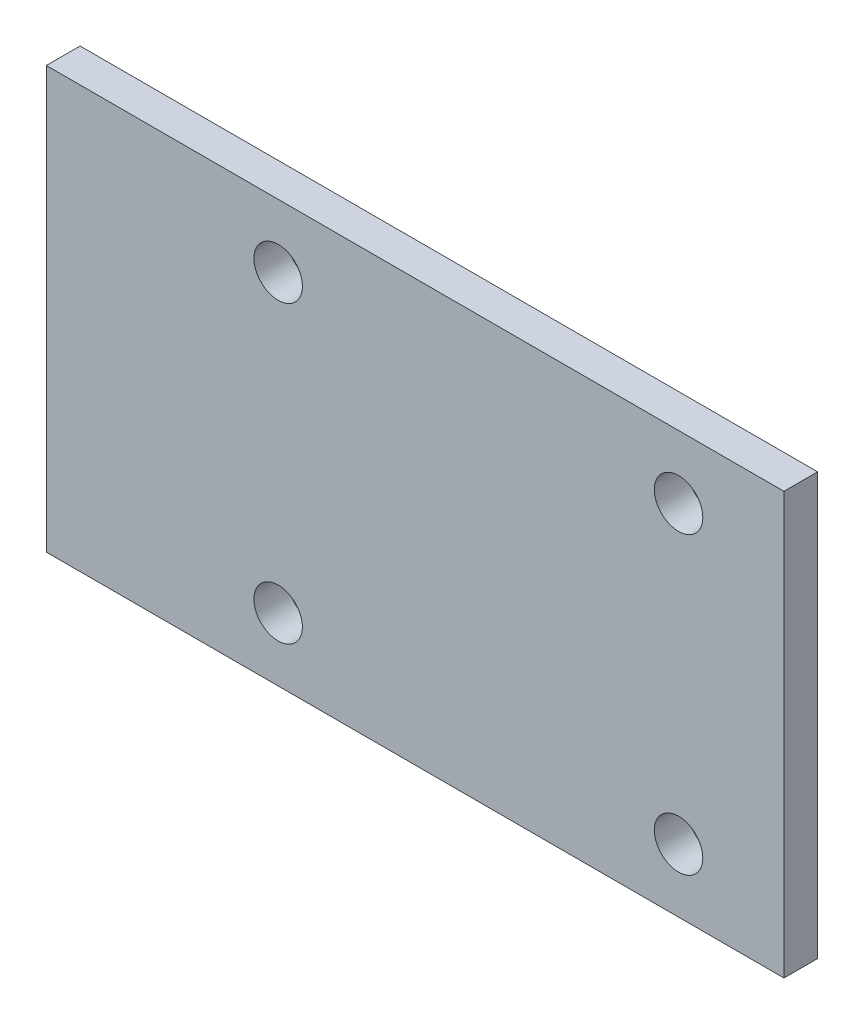
ISO-10303-21;
HEADER;
FILE_DESCRIPTION(('STEP AP214'),'2;1');
FILE_NAME('part.step','',(''),(''),'','','');
FILE_SCHEMA(('AUTOMOTIVE_DESIGN { 1 0 10303 214 1 1 1 1 }'));
ENDSEC;
DATA;
#1=APPLICATION_CONTEXT('core data for automotive mechanical design processes');
#2=APPLICATION_PROTOCOL_DEFINITION('international standard','automotive_design',2000,#1);
#3=PRODUCT_CONTEXT('',#1,'mechanical');
#4=PRODUCT('Part','Part','',(#3));
#5=PRODUCT_RELATED_PRODUCT_CATEGORY('part','',(#4));
#6=PRODUCT_DEFINITION_FORMATION('','',#4);
#7=PRODUCT_DEFINITION_CONTEXT('part definition',#1,'design');
#8=PRODUCT_DEFINITION('design','',#6,#7);
#9=PRODUCT_DEFINITION_SHAPE('','',#8);
#10=(LENGTH_UNIT() NAMED_UNIT(*) SI_UNIT(.MILLI.,.METRE.));
#11=(NAMED_UNIT(*) PLANE_ANGLE_UNIT() SI_UNIT($,.RADIAN.));
#12=(NAMED_UNIT(*) SI_UNIT($,.STERADIAN.) SOLID_ANGLE_UNIT());
#13=UNCERTAINTY_MEASURE_WITH_UNIT(LENGTH_MEASURE(1.E-05),#10,'distance_accuracy_value','');
#14=(GEOMETRIC_REPRESENTATION_CONTEXT(3) GLOBAL_UNCERTAINTY_ASSIGNED_CONTEXT((#13)) GLOBAL_UNIT_ASSIGNED_CONTEXT((#10,
#11,#12)) REPRESENTATION_CONTEXT('',''));
#15=CARTESIAN_POINT('',(0.,0.,0.));
#16=DIRECTION('',(0.,0.,1.));
#17=DIRECTION('',(1.,0.,0.));
#18=AXIS2_PLACEMENT_3D('',#15,#16,#17);
#19=CARTESIAN_POINT('',(17.5,10.,1.6));
#20=DIRECTION('',(-1.,0.,0.));
#21=DIRECTION('',(0.,-1.,0.));
#22=AXIS2_PLACEMENT_3D('',#19,#20,#21);
#23=PLANE('',#22);
#24=DIRECTION('',(0.,1.,0.));
#25=VECTOR('',#24,1.);
#26=CARTESIAN_POINT('',(17.5,10.,0.));
#27=LINE('',#26,#25);
#28=CARTESIAN_POINT('',(17.5,-10.,0.));
#29=VERTEX_POINT('',#28);
#30=CARTESIAN_POINT('',(17.5,10.,0.));
#31=VERTEX_POINT('',#30);
#32=EDGE_CURVE('E96',#29,#31,#27,.T.);
#33=ORIENTED_EDGE('',*,*,#32,.T.);
#34=DIRECTION('',(0.,0.,-1.));
#35=VECTOR('',#34,1.);
#36=CARTESIAN_POINT('',(17.5,10.,1.6));
#37=LINE('',#36,#35);
#38=CARTESIAN_POINT('',(17.5,10.,1.6));
#39=VERTEX_POINT('',#38);
#40=EDGE_CURVE('E11',#39,#31,#37,.T.);
#41=ORIENTED_EDGE('',*,*,#40,.F.);
#42=DIRECTION('',(0.,1.,0.));
#43=VECTOR('',#42,1.);
#44=CARTESIAN_POINT('',(17.5,10.,1.6));
#45=LINE('',#44,#43);
#46=CARTESIAN_POINT('',(17.5,-10.,1.6));
#47=VERTEX_POINT('',#46);
#48=EDGE_CURVE('E84',#47,#39,#45,.T.);
#49=ORIENTED_EDGE('',*,*,#48,.F.);
#50=DIRECTION('',(0.,0.,-1.));
#51=VECTOR('',#50,1.);
#52=CARTESIAN_POINT('',(17.5,-10.,1.6));
#53=LINE('',#52,#51);
#54=EDGE_CURVE('E92',#47,#29,#53,.T.);
#55=ORIENTED_EDGE('',*,*,#54,.T.);
#56=EDGE_LOOP('',(#33,#41,#49,#55));
#57=FACE_BOUND('',#56,.T.);
#58=ADVANCED_FACE('F33',(#57),#23,.F.);
#59=CARTESIAN_POINT('',(-17.5,10.,1.6));
#60=DIRECTION('',(0.,-1.,0.));
#61=DIRECTION('',(0.,0.,-1.));
#62=AXIS2_PLACEMENT_3D('',#59,#60,#61);
#63=PLANE('',#62);
#64=DIRECTION('',(-1.,0.,0.));
#65=VECTOR('',#64,1.);
#66=CARTESIAN_POINT('',(-17.5,10.,0.));
#67=LINE('',#66,#65);
#68=CARTESIAN_POINT('',(-17.5,10.,0.));
#69=VERTEX_POINT('',#68);
#70=EDGE_CURVE('E88',#31,#69,#67,.T.);
#71=ORIENTED_EDGE('',*,*,#70,.T.);
#72=DIRECTION('',(0.,0.,-1.));
#73=VECTOR('',#72,1.);
#74=CARTESIAN_POINT('',(-17.5,10.,1.6));
#75=LINE('',#74,#73);
#76=CARTESIAN_POINT('',(-17.5,10.,1.6));
#77=VERTEX_POINT('',#76);
#78=EDGE_CURVE('E41',#77,#69,#75,.T.);
#79=ORIENTED_EDGE('',*,*,#78,.F.);
#80=DIRECTION('',(-1.,0.,0.));
#81=VECTOR('',#80,1.);
#82=CARTESIAN_POINT('',(-17.5,10.,1.6));
#83=LINE('',#82,#81);
#84=EDGE_CURVE('E79',#39,#77,#83,.T.);
#85=ORIENTED_EDGE('',*,*,#84,.F.);
#86=ORIENTED_EDGE('',*,*,#40,.T.);
#87=EDGE_LOOP('',(#71,#79,#85,#86));
#88=FACE_BOUND('',#87,.T.);
#89=ADVANCED_FACE('F87',(#88),#63,.F.);
#90=CARTESIAN_POINT('',(-17.5,10.,1.6));
#91=DIRECTION('',(1.,0.,0.));
#92=DIRECTION('',(0.,1.,0.));
#93=AXIS2_PLACEMENT_3D('',#90,#91,#92);
#94=PLANE('',#93);
#95=DIRECTION('',(0.,-1.,0.));
#96=VECTOR('',#95,1.);
#97=CARTESIAN_POINT('',(-17.5,10.,0.));
#98=LINE('',#97,#96);
#99=CARTESIAN_POINT('',(-17.5,-10.,0.));
#100=VERTEX_POINT('',#99);
#101=EDGE_CURVE('E66',#69,#100,#98,.T.);
#102=ORIENTED_EDGE('',*,*,#101,.T.);
#103=DIRECTION('',(0.,0.,-1.));
#104=VECTOR('',#103,1.);
#105=CARTESIAN_POINT('',(-17.5,-10.,1.6));
#106=LINE('',#105,#104);
#107=CARTESIAN_POINT('',(-17.5,-10.,1.6));
#108=VERTEX_POINT('',#107);
#109=EDGE_CURVE('E89',#108,#100,#106,.T.);
#110=ORIENTED_EDGE('',*,*,#109,.F.);
#111=DIRECTION('',(0.,-1.,0.));
#112=VECTOR('',#111,1.);
#113=CARTESIAN_POINT('',(-17.5,10.,1.6));
#114=LINE('',#113,#112);
#115=EDGE_CURVE('E82',#77,#108,#114,.T.);
#116=ORIENTED_EDGE('',*,*,#115,.F.);
#117=ORIENTED_EDGE('',*,*,#78,.T.);
#118=EDGE_LOOP('',(#102,#110,#116,#117));
#119=FACE_BOUND('',#118,.T.);
#120=ADVANCED_FACE('F90',(#119),#94,.F.);
#121=CARTESIAN_POINT('',(-17.5,-10.,1.6));
#122=DIRECTION('',(0.,1.,0.));
#123=DIRECTION('',(0.,0.,1.));
#124=AXIS2_PLACEMENT_3D('',#121,#122,#123);
#125=PLANE('',#124);
#126=DIRECTION('',(1.,0.,0.));
#127=VECTOR('',#126,1.);
#128=CARTESIAN_POINT('',(-17.5,-10.,0.));
#129=LINE('',#128,#127);
#130=EDGE_CURVE('E72',#100,#29,#129,.T.);
#131=ORIENTED_EDGE('',*,*,#130,.T.);
#132=ORIENTED_EDGE('',*,*,#54,.F.);
#133=DIRECTION('',(1.,0.,0.));
#134=VECTOR('',#133,1.);
#135=CARTESIAN_POINT('',(-17.5,-10.,1.6));
#136=LINE('',#135,#134);
#137=EDGE_CURVE('E49',#108,#47,#136,.T.);
#138=ORIENTED_EDGE('',*,*,#137,.F.);
#139=ORIENTED_EDGE('',*,*,#109,.T.);
#140=EDGE_LOOP('',(#131,#132,#138,#139));
#141=FACE_BOUND('',#140,.T.);
#142=ADVANCED_FACE('F104',(#141),#125,.F.);
#143=CARTESIAN_POINT('',(0.,0.,1.6));
#144=DIRECTION('',(0.,0.,1.));
#145=DIRECTION('',(1.,0.,0.));
#146=AXIS2_PLACEMENT_3D('',#143,#144,#145);
#147=PLANE('',#146);
#148=CARTESIAN_POINT('',(12.5,-7.,1.6));
#149=DIRECTION('',(0.,0.,1.));
#150=DIRECTION('',(1.,0.,0.));
#151=AXIS2_PLACEMENT_3D('',#148,#149,#150);
#152=CIRCLE('',#151,1.15);
#153=CARTESIAN_POINT('',(13.65,-7.,1.6));
#154=VERTEX_POINT('',#153);
#155=EDGE_CURVE('E116',#154,#154,#152,.T.);
#156=ORIENTED_EDGE('',*,*,#155,.F.);
#157=EDGE_LOOP('',(#156));
#158=FACE_BOUND('',#157,.T.);
#159=CARTESIAN_POINT('',(-6.5,-7.,1.6));
#160=DIRECTION('',(0.,0.,1.));
#161=DIRECTION('',(1.,0.,0.));
#162=AXIS2_PLACEMENT_3D('',#159,#160,#161);
#163=CIRCLE('',#162,1.15);
#164=CARTESIAN_POINT('',(-5.35,-7.,1.6));
#165=VERTEX_POINT('',#164);
#166=EDGE_CURVE('E123',#165,#165,#163,.T.);
#167=ORIENTED_EDGE('',*,*,#166,.F.);
#168=EDGE_LOOP('',(#167));
#169=FACE_BOUND('',#168,.T.);
#170=CARTESIAN_POINT('',(-6.5,7.,1.6));
#171=DIRECTION('',(0.,0.,1.));
#172=DIRECTION('',(1.,0.,0.));
#173=AXIS2_PLACEMENT_3D('',#170,#171,#172);
#174=CIRCLE('',#173,1.15);
#175=CARTESIAN_POINT('',(-5.35,7.,1.6));
#176=VERTEX_POINT('',#175);
#177=EDGE_CURVE('E115',#176,#176,#174,.T.);
#178=ORIENTED_EDGE('',*,*,#177,.F.);
#179=EDGE_LOOP('',(#178));
#180=FACE_BOUND('',#179,.T.);
#181=CARTESIAN_POINT('',(12.5,7.,1.6));
#182=DIRECTION('',(0.,0.,1.));
#183=DIRECTION('',(1.,0.,0.));
#184=AXIS2_PLACEMENT_3D('',#181,#182,#183);
#185=CIRCLE('',#184,1.15);
#186=CARTESIAN_POINT('',(13.65,7.,1.6));
#187=VERTEX_POINT('',#186);
#188=EDGE_CURVE('E99',#187,#187,#185,.T.);
#189=ORIENTED_EDGE('',*,*,#188,.F.);
#190=EDGE_LOOP('',(#189));
#191=FACE_BOUND('',#190,.T.);
#192=ORIENTED_EDGE('',*,*,#48,.T.);
#193=ORIENTED_EDGE('',*,*,#84,.T.);
#194=ORIENTED_EDGE('',*,*,#115,.T.);
#195=ORIENTED_EDGE('',*,*,#137,.T.);
#196=EDGE_LOOP('',(#192,#193,#194,#195));
#197=FACE_BOUND('',#196,.T.);
#198=ADVANCED_FACE('F80',(#158,#169,#180,#191,#197),#147,.T.);
#199=CARTESIAN_POINT('',(0.,0.,0.));
#200=DIRECTION('',(0.,0.,1.));
#201=DIRECTION('',(1.,0.,0.));
#202=AXIS2_PLACEMENT_3D('',#199,#200,#201);
#203=PLANE('',#202);
#204=CARTESIAN_POINT('',(12.5,-7.,0.));
#205=DIRECTION('',(0.,0.,1.));
#206=DIRECTION('',(1.,0.,0.));
#207=AXIS2_PLACEMENT_3D('',#204,#205,#206);
#208=CIRCLE('',#207,1.15);
#209=CARTESIAN_POINT('',(13.65,-7.,0.));
#210=VERTEX_POINT('',#209);
#211=EDGE_CURVE('E120',#210,#210,#208,.T.);
#212=ORIENTED_EDGE('',*,*,#211,.T.);
#213=EDGE_LOOP('',(#212));
#214=FACE_BOUND('',#213,.T.);
#215=CARTESIAN_POINT('',(-6.5,-7.,0.));
#216=DIRECTION('',(0.,0.,1.));
#217=DIRECTION('',(1.,0.,0.));
#218=AXIS2_PLACEMENT_3D('',#215,#216,#217);
#219=CIRCLE('',#218,1.15);
#220=CARTESIAN_POINT('',(-5.35,-7.,0.));
#221=VERTEX_POINT('',#220);
#222=EDGE_CURVE('E119',#221,#221,#219,.T.);
#223=ORIENTED_EDGE('',*,*,#222,.T.);
#224=EDGE_LOOP('',(#223));
#225=FACE_BOUND('',#224,.T.);
#226=CARTESIAN_POINT('',(-6.5,7.,0.));
#227=DIRECTION('',(0.,0.,1.));
#228=DIRECTION('',(1.,0.,0.));
#229=AXIS2_PLACEMENT_3D('',#226,#227,#228);
#230=CIRCLE('',#229,1.15);
#231=CARTESIAN_POINT('',(-5.35,7.,0.));
#232=VERTEX_POINT('',#231);
#233=EDGE_CURVE('E126',#232,#232,#230,.T.);
#234=ORIENTED_EDGE('',*,*,#233,.T.);
#235=EDGE_LOOP('',(#234));
#236=FACE_BOUND('',#235,.T.);
#237=CARTESIAN_POINT('',(12.5,7.,0.));
#238=DIRECTION('',(0.,0.,1.));
#239=DIRECTION('',(1.,0.,0.));
#240=AXIS2_PLACEMENT_3D('',#237,#238,#239);
#241=CIRCLE('',#240,1.15);
#242=CARTESIAN_POINT('',(13.65,7.,0.));
#243=VERTEX_POINT('',#242);
#244=EDGE_CURVE('E112',#243,#243,#241,.T.);
#245=ORIENTED_EDGE('',*,*,#244,.T.);
#246=EDGE_LOOP('',(#245));
#247=FACE_BOUND('',#246,.T.);
#248=ORIENTED_EDGE('',*,*,#32,.F.);
#249=ORIENTED_EDGE('',*,*,#130,.F.);
#250=ORIENTED_EDGE('',*,*,#101,.F.);
#251=ORIENTED_EDGE('',*,*,#70,.F.);
#252=EDGE_LOOP('',(#248,#249,#250,#251));
#253=FACE_BOUND('',#252,.T.);
#254=ADVANCED_FACE('F107',(#214,#225,#236,#247,#253),#203,.F.);
#255=CARTESIAN_POINT('',(12.5,7.,1.601));
#256=DIRECTION('',(0.,0.,-1.));
#257=DIRECTION('',(-1.,0.,0.));
#258=AXIS2_PLACEMENT_3D('',#255,#256,#257);
#259=CYLINDRICAL_SURFACE('',#258,1.15);
#260=ORIENTED_EDGE('',*,*,#188,.T.);
#261=EDGE_LOOP('',(#260));
#262=FACE_BOUND('',#261,.T.);
#263=ORIENTED_EDGE('',*,*,#244,.F.);
#264=EDGE_LOOP('',(#263));
#265=FACE_BOUND('',#264,.T.);
#266=ADVANCED_FACE('F139',(#262,#265),#259,.F.);
#267=CARTESIAN_POINT('',(-6.5,7.,1.601));
#268=DIRECTION('',(0.,0.,-1.));
#269=DIRECTION('',(-1.,0.,0.));
#270=AXIS2_PLACEMENT_3D('',#267,#268,#269);
#271=CYLINDRICAL_SURFACE('',#270,1.15);
#272=ORIENTED_EDGE('',*,*,#177,.T.);
#273=EDGE_LOOP('',(#272));
#274=FACE_BOUND('',#273,.T.);
#275=ORIENTED_EDGE('',*,*,#233,.F.);
#276=EDGE_LOOP('',(#275));
#277=FACE_BOUND('',#276,.T.);
#278=ADVANCED_FACE('F136',(#274,#277),#271,.F.);
#279=CARTESIAN_POINT('',(-6.5,-7.,1.601));
#280=DIRECTION('',(0.,0.,-1.));
#281=DIRECTION('',(-1.,0.,0.));
#282=AXIS2_PLACEMENT_3D('',#279,#280,#281);
#283=CYLINDRICAL_SURFACE('',#282,1.15);
#284=ORIENTED_EDGE('',*,*,#166,.T.);
#285=EDGE_LOOP('',(#284));
#286=FACE_BOUND('',#285,.T.);
#287=ORIENTED_EDGE('',*,*,#222,.F.);
#288=EDGE_LOOP('',(#287));
#289=FACE_BOUND('',#288,.T.);
#290=ADVANCED_FACE('F138',(#286,#289),#283,.F.);
#291=CARTESIAN_POINT('',(12.5,-7.,1.601));
#292=DIRECTION('',(0.,0.,-1.));
#293=DIRECTION('',(-1.,0.,0.));
#294=AXIS2_PLACEMENT_3D('',#291,#292,#293);
#295=CYLINDRICAL_SURFACE('',#294,1.15);
#296=ORIENTED_EDGE('',*,*,#155,.T.);
#297=EDGE_LOOP('',(#296));
#298=FACE_BOUND('',#297,.T.);
#299=ORIENTED_EDGE('',*,*,#211,.F.);
#300=EDGE_LOOP('',(#299));
#301=FACE_BOUND('',#300,.T.);
#302=ADVANCED_FACE('F146',(#298,#301),#295,.F.);
#303=CLOSED_SHELL('',(#58,#89,#120,#142,#198,#254,#266,#278,#290,#302));
#304=MANIFOLD_SOLID_BREP('B2',#303);
#305=ADVANCED_BREP_SHAPE_REPRESENTATION('',(#18,#304),#14);
#306=SHAPE_DEFINITION_REPRESENTATION(#9,#305);
ENDSEC;
END-ISO-10303-21;
